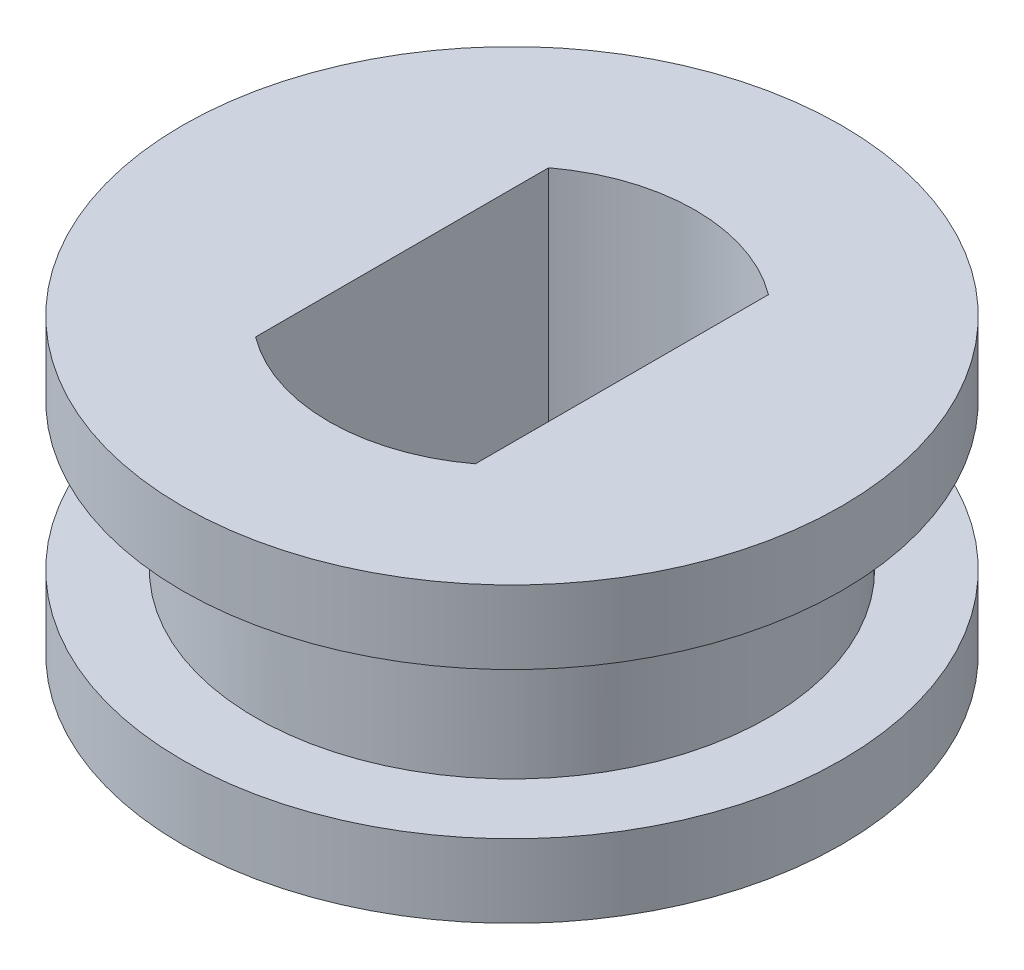
ISO-10303-21;
HEADER;
FILE_DESCRIPTION(('STEP AP214'),'2;1');
FILE_NAME('part.step','',(''),(''),'','','');
FILE_SCHEMA(('AUTOMOTIVE_DESIGN { 1 0 10303 214 1 1 1 1 }'));
ENDSEC;
DATA;
#1=APPLICATION_CONTEXT('core data for automotive mechanical design processes');
#2=APPLICATION_PROTOCOL_DEFINITION('international standard','automotive_design',2000,#1);
#3=PRODUCT_CONTEXT('',#1,'mechanical');
#4=PRODUCT('Part','Part','',(#3));
#5=PRODUCT_RELATED_PRODUCT_CATEGORY('part','',(#4));
#6=PRODUCT_DEFINITION_FORMATION('','',#4);
#7=PRODUCT_DEFINITION_CONTEXT('part definition',#1,'design');
#8=PRODUCT_DEFINITION('design','',#6,#7);
#9=PRODUCT_DEFINITION_SHAPE('','',#8);
#10=(LENGTH_UNIT() NAMED_UNIT(*) SI_UNIT(.MILLI.,.METRE.));
#11=(NAMED_UNIT(*) PLANE_ANGLE_UNIT() SI_UNIT($,.RADIAN.));
#12=(NAMED_UNIT(*) SI_UNIT($,.STERADIAN.) SOLID_ANGLE_UNIT());
#13=UNCERTAINTY_MEASURE_WITH_UNIT(LENGTH_MEASURE(1.E-05),#10,'distance_accuracy_value','');
#14=(GEOMETRIC_REPRESENTATION_CONTEXT(3) GLOBAL_UNCERTAINTY_ASSIGNED_CONTEXT((#13)) GLOBAL_UNIT_ASSIGNED_CONTEXT((#10,
#11,#12)) REPRESENTATION_CONTEXT('',''));
#15=CARTESIAN_POINT('',(0.,0.,0.));
#16=DIRECTION('',(0.,0.,1.));
#17=DIRECTION('',(1.,0.,0.));
#18=AXIS2_PLACEMENT_3D('',#15,#16,#17);
#19=CARTESIAN_POINT('',(0.,4.,0.));
#20=DIRECTION('',(0.,-1.,0.));
#21=DIRECTION('',(0.,0.,-1.));
#22=AXIS2_PLACEMENT_3D('',#19,#20,#21);
#23=CYLINDRICAL_SURFACE('',#22,3.5);
#24=CARTESIAN_POINT('',(0.,3.,0.));
#25=DIRECTION('',(0.,1.,0.));
#26=DIRECTION('',(0.,0.,1.));
#27=AXIS2_PLACEMENT_3D('',#24,#25,#26);
#28=CIRCLE('',#27,3.5);
#29=CARTESIAN_POINT('',(0.,3.,3.5));
#30=VERTEX_POINT('',#29);
#31=EDGE_CURVE('E40',#30,#30,#28,.T.);
#32=ORIENTED_EDGE('',*,*,#31,.F.);
#33=EDGE_LOOP('',(#32));
#34=FACE_BOUND('',#33,.T.);
#35=CARTESIAN_POINT('',(0.,1.,0.));
#36=DIRECTION('',(0.,-1.,0.));
#37=DIRECTION('',(0.,0.,-1.));
#38=AXIS2_PLACEMENT_3D('',#35,#36,#37);
#39=CIRCLE('',#38,3.5);
#40=CARTESIAN_POINT('',(0.,1.,-3.5));
#41=VERTEX_POINT('',#40);
#42=EDGE_CURVE('E11',#41,#41,#39,.T.);
#43=ORIENTED_EDGE('',*,*,#42,.F.);
#44=EDGE_LOOP('',(#43));
#45=FACE_BOUND('',#44,.T.);
#46=ADVANCED_FACE('F33',(#34,#45),#23,.T.);
#47=CARTESIAN_POINT('',(0.,4.,0.));
#48=DIRECTION('',(0.,1.,0.));
#49=DIRECTION('',(0.,0.,1.));
#50=AXIS2_PLACEMENT_3D('',#47,#48,#49);
#51=PLANE('',#50);
#52=DIRECTION('',(0.,0.,-1.));
#53=VECTOR('',#52,1.);
#54=CARTESIAN_POINT('',(1.5,4.,-2.));
#55=LINE('',#54,#53);
#56=CARTESIAN_POINT('',(1.5,4.,2.));
#57=VERTEX_POINT('',#56);
#58=CARTESIAN_POINT('',(1.5,4.,-2.));
#59=VERTEX_POINT('',#58);
#60=EDGE_CURVE('E81',#57,#59,#55,.T.);
#61=ORIENTED_EDGE('',*,*,#60,.F.);
#62=CARTESIAN_POINT('',(0.,4.,0.));
#63=DIRECTION('',(0.,1.,0.));
#64=DIRECTION('',(0.,0.,1.));
#65=AXIS2_PLACEMENT_3D('',#62,#63,#64);
#66=CIRCLE('',#65,2.5);
#67=CARTESIAN_POINT('',(-1.5,4.,2.));
#68=VERTEX_POINT('',#67);
#69=EDGE_CURVE('E73',#68,#57,#66,.T.);
#70=ORIENTED_EDGE('',*,*,#69,.F.);
#71=DIRECTION('',(0.,0.,1.));
#72=VECTOR('',#71,1.);
#73=CARTESIAN_POINT('',(-1.5,4.,-2.));
#74=LINE('',#73,#72);
#75=CARTESIAN_POINT('',(-1.5,4.,-2.));
#76=VERTEX_POINT('',#75);
#77=EDGE_CURVE('E96',#76,#68,#74,.T.);
#78=ORIENTED_EDGE('',*,*,#77,.F.);
#79=CARTESIAN_POINT('',(0.,4.,0.));
#80=DIRECTION('',(0.,1.,0.));
#81=DIRECTION('',(0.,0.,1.));
#82=AXIS2_PLACEMENT_3D('',#79,#80,#81);
#83=CIRCLE('',#82,2.5);
#84=EDGE_CURVE('E94',#59,#76,#83,.T.);
#85=ORIENTED_EDGE('',*,*,#84,.F.);
#86=EDGE_LOOP('',(#61,#70,#78,#85));
#87=FACE_BOUND('',#86,.T.);
#88=CARTESIAN_POINT('',(0.,4.,0.));
#89=DIRECTION('',(0.,1.,0.));
#90=DIRECTION('',(0.,0.,1.));
#91=AXIS2_PLACEMENT_3D('',#88,#89,#90);
#92=CIRCLE('',#91,4.5);
#93=CARTESIAN_POINT('',(0.,4.,4.5));
#94=VERTEX_POINT('',#93);
#95=EDGE_CURVE('E130',#94,#94,#92,.T.);
#96=ORIENTED_EDGE('',*,*,#95,.T.);
#97=EDGE_LOOP('',(#96));
#98=FACE_BOUND('',#97,.T.);
#99=ADVANCED_FACE('F92',(#87,#98),#51,.T.);
#100=CARTESIAN_POINT('',(0.,0.,0.));
#101=DIRECTION('',(0.,1.,0.));
#102=DIRECTION('',(0.,0.,1.));
#103=AXIS2_PLACEMENT_3D('',#100,#101,#102);
#104=PLANE('',#103);
#105=CARTESIAN_POINT('',(0.,0.,0.));
#106=DIRECTION('',(0.,1.,0.));
#107=DIRECTION('',(0.,0.,1.));
#108=AXIS2_PLACEMENT_3D('',#105,#106,#107);
#109=CIRCLE('',#108,2.5);
#110=CARTESIAN_POINT('',(-1.5,0.,2.));
#111=VERTEX_POINT('',#110);
#112=CARTESIAN_POINT('',(1.5,0.,2.));
#113=VERTEX_POINT('',#112);
#114=EDGE_CURVE('E55',#111,#113,#109,.T.);
#115=ORIENTED_EDGE('',*,*,#114,.T.);
#116=DIRECTION('',(0.,0.,-1.));
#117=VECTOR('',#116,1.);
#118=CARTESIAN_POINT('',(1.5,0.,-2.));
#119=LINE('',#118,#117);
#120=CARTESIAN_POINT('',(1.5,0.,-2.));
#121=VERTEX_POINT('',#120);
#122=EDGE_CURVE('E88',#113,#121,#119,.T.);
#123=ORIENTED_EDGE('',*,*,#122,.T.);
#124=CARTESIAN_POINT('',(0.,0.,0.));
#125=DIRECTION('',(0.,1.,0.));
#126=DIRECTION('',(0.,0.,1.));
#127=AXIS2_PLACEMENT_3D('',#124,#125,#126);
#128=CIRCLE('',#127,2.5);
#129=CARTESIAN_POINT('',(-1.5,0.,-2.));
#130=VERTEX_POINT('',#129);
#131=EDGE_CURVE('E104',#121,#130,#128,.T.);
#132=ORIENTED_EDGE('',*,*,#131,.T.);
#133=DIRECTION('',(0.,0.,1.));
#134=VECTOR('',#133,1.);
#135=CARTESIAN_POINT('',(-1.5,0.,-2.));
#136=LINE('',#135,#134);
#137=EDGE_CURVE('E82',#130,#111,#136,.T.);
#138=ORIENTED_EDGE('',*,*,#137,.T.);
#139=EDGE_LOOP('',(#115,#123,#132,#138));
#140=FACE_BOUND('',#139,.T.);
#141=CARTESIAN_POINT('',(0.,0.,0.));
#142=DIRECTION('',(0.,-1.,0.));
#143=DIRECTION('',(0.,0.,-1.));
#144=AXIS2_PLACEMENT_3D('',#141,#142,#143);
#145=CIRCLE('',#144,4.5);
#146=CARTESIAN_POINT('',(0.,0.,-4.5));
#147=VERTEX_POINT('',#146);
#148=EDGE_CURVE('E131',#147,#147,#145,.T.);
#149=ORIENTED_EDGE('',*,*,#148,.T.);
#150=EDGE_LOOP('',(#149));
#151=FACE_BOUND('',#150,.T.);
#152=ADVANCED_FACE('F162',(#140,#151),#104,.F.);
#153=CARTESIAN_POINT('',(0.,4.,0.));
#154=DIRECTION('',(0.,-1.,0.));
#155=DIRECTION('',(0.,0.,-1.));
#156=AXIS2_PLACEMENT_3D('',#153,#154,#155);
#157=CYLINDRICAL_SURFACE('',#156,2.5);
#158=ORIENTED_EDGE('',*,*,#114,.F.);
#159=DIRECTION('',(0.,-1.,0.));
#160=VECTOR('',#159,1.);
#161=CARTESIAN_POINT('',(-1.5,4.,2.));
#162=LINE('',#161,#160);
#163=EDGE_CURVE('E77',#68,#111,#162,.T.);
#164=ORIENTED_EDGE('',*,*,#163,.F.);
#165=ORIENTED_EDGE('',*,*,#69,.T.);
#166=DIRECTION('',(0.,-1.,0.));
#167=VECTOR('',#166,1.);
#168=CARTESIAN_POINT('',(1.5,4.,2.));
#169=LINE('',#168,#167);
#170=EDGE_CURVE('E76',#57,#113,#169,.T.);
#171=ORIENTED_EDGE('',*,*,#170,.T.);
#172=EDGE_LOOP('',(#158,#164,#165,#171));
#173=FACE_BOUND('',#172,.T.);
#174=ADVANCED_FACE('F75',(#173),#157,.F.);
#175=CARTESIAN_POINT('',(1.5,4.,-2.));
#176=DIRECTION('',(-1.,0.,0.));
#177=DIRECTION('',(0.,0.,1.));
#178=AXIS2_PLACEMENT_3D('',#175,#176,#177);
#179=PLANE('',#178);
#180=ORIENTED_EDGE('',*,*,#122,.F.);
#181=ORIENTED_EDGE('',*,*,#170,.F.);
#182=ORIENTED_EDGE('',*,*,#60,.T.);
#183=DIRECTION('',(0.,-1.,0.));
#184=VECTOR('',#183,1.);
#185=CARTESIAN_POINT('',(1.5,4.,-2.));
#186=LINE('',#185,#184);
#187=EDGE_CURVE('E89',#59,#121,#186,.T.);
#188=ORIENTED_EDGE('',*,*,#187,.T.);
#189=EDGE_LOOP('',(#180,#181,#182,#188));
#190=FACE_BOUND('',#189,.T.);
#191=ADVANCED_FACE('F85',(#190),#179,.T.);
#192=CARTESIAN_POINT('',(0.,4.,0.));
#193=DIRECTION('',(0.,-1.,0.));
#194=DIRECTION('',(0.,0.,-1.));
#195=AXIS2_PLACEMENT_3D('',#192,#193,#194);
#196=CYLINDRICAL_SURFACE('',#195,2.5);
#197=ORIENTED_EDGE('',*,*,#131,.F.);
#198=ORIENTED_EDGE('',*,*,#187,.F.);
#199=ORIENTED_EDGE('',*,*,#84,.T.);
#200=DIRECTION('',(0.,-1.,0.));
#201=VECTOR('',#200,1.);
#202=CARTESIAN_POINT('',(-1.5,4.,-2.));
#203=LINE('',#202,#201);
#204=EDGE_CURVE('E47',#76,#130,#203,.T.);
#205=ORIENTED_EDGE('',*,*,#204,.T.);
#206=EDGE_LOOP('',(#197,#198,#199,#205));
#207=FACE_BOUND('',#206,.T.);
#208=ADVANCED_FACE('F154',(#207),#196,.F.);
#209=CARTESIAN_POINT('',(-1.5,4.,-2.));
#210=DIRECTION('',(1.,0.,0.));
#211=DIRECTION('',(0.,0.,-1.));
#212=AXIS2_PLACEMENT_3D('',#209,#210,#211);
#213=PLANE('',#212);
#214=ORIENTED_EDGE('',*,*,#137,.F.);
#215=ORIENTED_EDGE('',*,*,#204,.F.);
#216=ORIENTED_EDGE('',*,*,#77,.T.);
#217=ORIENTED_EDGE('',*,*,#163,.T.);
#218=EDGE_LOOP('',(#214,#215,#216,#217));
#219=FACE_BOUND('',#218,.T.);
#220=ADVANCED_FACE('F149',(#219),#213,.T.);
#221=CARTESIAN_POINT('',(0.,3.,0.));
#222=DIRECTION('',(0.,1.,0.));
#223=DIRECTION('',(0.,0.,1.));
#224=AXIS2_PLACEMENT_3D('',#221,#222,#223);
#225=CYLINDRICAL_SURFACE('',#224,4.5);
#226=CARTESIAN_POINT('',(0.,3.,0.));
#227=DIRECTION('',(0.,1.,0.));
#228=DIRECTION('',(0.,0.,1.));
#229=AXIS2_PLACEMENT_3D('',#226,#227,#228);
#230=CIRCLE('',#229,4.5);
#231=CARTESIAN_POINT('',(0.,3.,4.5));
#232=VERTEX_POINT('',#231);
#233=EDGE_CURVE('E102',#232,#232,#230,.T.);
#234=ORIENTED_EDGE('',*,*,#233,.T.);
#235=EDGE_LOOP('',(#234));
#236=FACE_BOUND('',#235,.T.);
#237=ORIENTED_EDGE('',*,*,#95,.F.);
#238=EDGE_LOOP('',(#237));
#239=FACE_BOUND('',#238,.T.);
#240=ADVANCED_FACE('F140',(#236,#239),#225,.T.);
#241=CARTESIAN_POINT('',(0.,3.,0.));
#242=DIRECTION('',(0.,1.,0.));
#243=DIRECTION('',(0.,0.,1.));
#244=AXIS2_PLACEMENT_3D('',#241,#242,#243);
#245=PLANE('',#244);
#246=ORIENTED_EDGE('',*,*,#31,.T.);
#247=EDGE_LOOP('',(#246));
#248=FACE_BOUND('',#247,.T.);
#249=ORIENTED_EDGE('',*,*,#233,.F.);
#250=EDGE_LOOP('',(#249));
#251=FACE_BOUND('',#250,.T.);
#252=ADVANCED_FACE('F114',(#248,#251),#245,.F.);
#253=CARTESIAN_POINT('',(0.,1.,0.));
#254=DIRECTION('',(0.,-1.,0.));
#255=DIRECTION('',(0.,0.,-1.));
#256=AXIS2_PLACEMENT_3D('',#253,#254,#255);
#257=CYLINDRICAL_SURFACE('',#256,4.5);
#258=CARTESIAN_POINT('',(0.,1.,0.));
#259=DIRECTION('',(0.,-1.,0.));
#260=DIRECTION('',(0.,0.,-1.));
#261=AXIS2_PLACEMENT_3D('',#258,#259,#260);
#262=CIRCLE('',#261,4.5);
#263=CARTESIAN_POINT('',(0.,1.,-4.5));
#264=VERTEX_POINT('',#263);
#265=EDGE_CURVE('E128',#264,#264,#262,.T.);
#266=ORIENTED_EDGE('',*,*,#265,.T.);
#267=EDGE_LOOP('',(#266));
#268=FACE_BOUND('',#267,.T.);
#269=ORIENTED_EDGE('',*,*,#148,.F.);
#270=EDGE_LOOP('',(#269));
#271=FACE_BOUND('',#270,.T.);
#272=ADVANCED_FACE('F124',(#268,#271),#257,.T.);
#273=CARTESIAN_POINT('',(0.,1.,0.));
#274=DIRECTION('',(0.,-1.,0.));
#275=DIRECTION('',(0.,0.,-1.));
#276=AXIS2_PLACEMENT_3D('',#273,#274,#275);
#277=PLANE('',#276);
#278=ORIENTED_EDGE('',*,*,#42,.T.);
#279=EDGE_LOOP('',(#278));
#280=FACE_BOUND('',#279,.T.);
#281=ORIENTED_EDGE('',*,*,#265,.F.);
#282=EDGE_LOOP('',(#281));
#283=FACE_BOUND('',#282,.T.);
#284=ADVANCED_FACE('F121',(#280,#283),#277,.F.);
#285=CLOSED_SHELL('',(#46,#99,#152,#174,#191,#208,#220,#240,#252,#272,#284));
#286=MANIFOLD_SOLID_BREP('B2',#285);
#287=ADVANCED_BREP_SHAPE_REPRESENTATION('',(#18,#286),#14);
#288=SHAPE_DEFINITION_REPRESENTATION(#9,#287);
ENDSEC;
END-ISO-10303-21;
